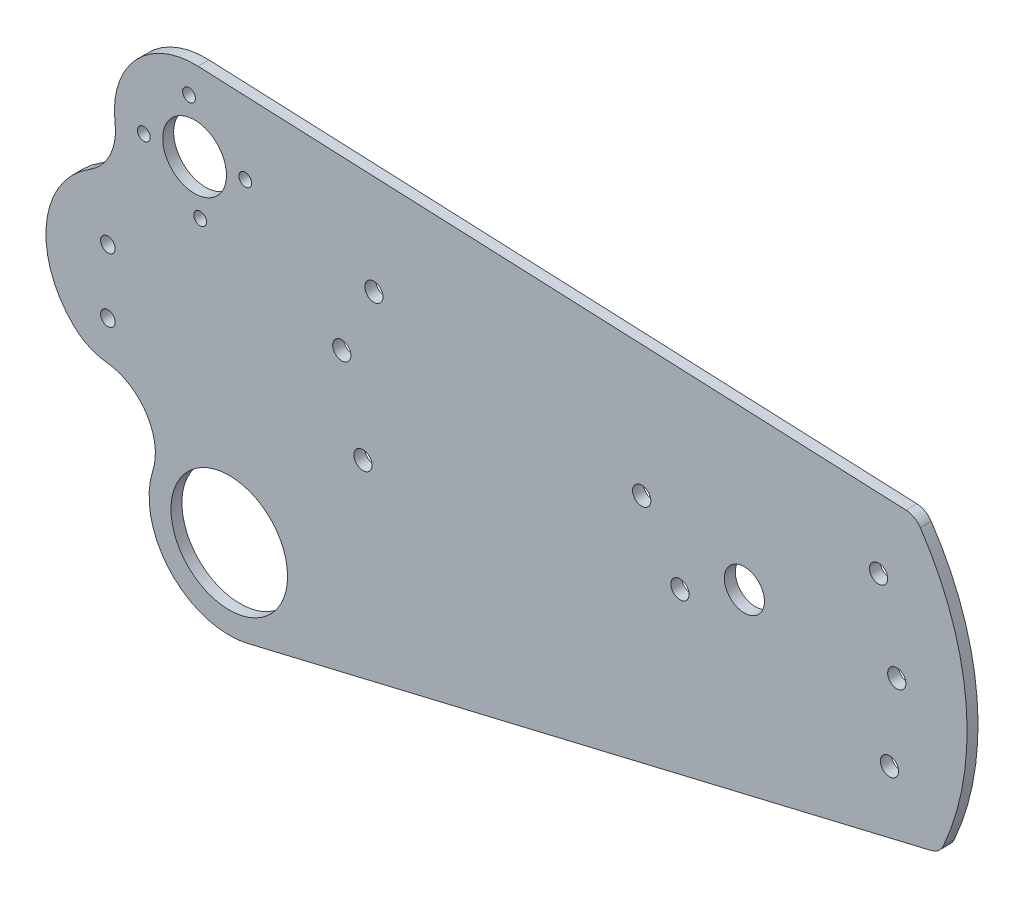
ISO-10303-21;
HEADER;
FILE_DESCRIPTION(('STEP AP214'),'2;1');
FILE_NAME('part.step','',(''),(''),'','','');
FILE_SCHEMA(('AUTOMOTIVE_DESIGN { 1 0 10303 214 1 1 1 1 }'));
ENDSEC;
DATA;
#1=APPLICATION_CONTEXT('core data for automotive mechanical design processes');
#2=APPLICATION_PROTOCOL_DEFINITION('international standard','automotive_design',2000,#1);
#3=PRODUCT_CONTEXT('',#1,'mechanical');
#4=PRODUCT('Part','Part','',(#3));
#5=PRODUCT_RELATED_PRODUCT_CATEGORY('part','',(#4));
#6=PRODUCT_DEFINITION_FORMATION('','',#4);
#7=PRODUCT_DEFINITION_CONTEXT('part definition',#1,'design');
#8=PRODUCT_DEFINITION('design','',#6,#7);
#9=PRODUCT_DEFINITION_SHAPE('','',#8);
#10=(LENGTH_UNIT() NAMED_UNIT(*) SI_UNIT(.MILLI.,.METRE.));
#11=(NAMED_UNIT(*) PLANE_ANGLE_UNIT() SI_UNIT($,.RADIAN.));
#12=(NAMED_UNIT(*) SI_UNIT($,.STERADIAN.) SOLID_ANGLE_UNIT());
#13=UNCERTAINTY_MEASURE_WITH_UNIT(LENGTH_MEASURE(1.E-05),#10,'distance_accuracy_value','');
#14=(GEOMETRIC_REPRESENTATION_CONTEXT(3) GLOBAL_UNCERTAINTY_ASSIGNED_CONTEXT((#13)) GLOBAL_UNIT_ASSIGNED_CONTEXT((#10,
#11,#12)) REPRESENTATION_CONTEXT('',''));
#15=CARTESIAN_POINT('',(0.,0.,0.));
#16=DIRECTION('',(0.,0.,1.));
#17=DIRECTION('',(1.,0.,0.));
#18=AXIS2_PLACEMENT_3D('',#15,#16,#17);
#19=CARTESIAN_POINT('',(1.91215632842237,44.5201547339827,3.));
#20=DIRECTION('',(0.0429107910239942,0.999078907801428,0.));
#21=DIRECTION('',(-0.999078907801428,0.0429107910239942,0.));
#22=AXIS2_PLACEMENT_3D('',#19,#20,#21);
#23=PLANE('',#22);
#24=DIRECTION('',(0.999078907801428,-0.0429107910239942,0.));
#25=VECTOR('',#24,1.);
#26=CARTESIAN_POINT('',(1.91215632842237,44.5201547339827,0.));
#27=LINE('',#26,#25);
#28=CARTESIAN_POINT('',(-113.560266524185,49.4797359716314,0.));
#29=VERTEX_POINT('',#28);
#30=CARTESIAN_POINT('',(80.7215881233943,41.1352618771054,0.));
#31=VERTEX_POINT('',#30);
#32=EDGE_CURVE('E176',#29,#31,#27,.T.);
#33=ORIENTED_EDGE('',*,*,#32,.F.);
#34=DIRECTION('',(0.,0.,-1.));
#35=VECTOR('',#34,1.);
#36=CARTESIAN_POINT('',(-113.560266524185,49.4797359716314,3.));
#37=LINE('',#36,#35);
#38=CARTESIAN_POINT('',(-113.560266524185,49.4797359716314,3.));
#39=VERTEX_POINT('',#38);
#40=EDGE_CURVE('E11',#39,#29,#37,.T.);
#41=ORIENTED_EDGE('',*,*,#40,.F.);
#42=DIRECTION('',(0.999078907801428,-0.0429107910239942,0.));
#43=VECTOR('',#42,1.);
#44=CARTESIAN_POINT('',(1.91215632842237,44.5201547339827,3.));
#45=LINE('',#44,#43);
#46=CARTESIAN_POINT('',(80.7215881233943,41.1352618771054,3.));
#47=VERTEX_POINT('',#46);
#48=EDGE_CURVE('E373',#39,#47,#45,.T.);
#49=ORIENTED_EDGE('',*,*,#48,.T.);
#50=DIRECTION('',(0.,0.,-1.));
#51=VECTOR('',#50,1.);
#52=CARTESIAN_POINT('',(80.7215881233943,41.1352618771054,3.));
#53=LINE('',#52,#51);
#54=EDGE_CURVE('E95',#47,#31,#53,.T.);
#55=ORIENTED_EDGE('',*,*,#54,.T.);
#56=EDGE_LOOP('',(#33,#41,#49,#55));
#57=FACE_BOUND('',#56,.T.);
#58=ADVANCED_FACE('F35',(#57),#23,.T.);
#59=CARTESIAN_POINT('',(-114.504303926713,27.5,3.));
#60=DIRECTION('',(0.,0.,-1.));
#61=DIRECTION('',(-1.,0.,0.));
#62=AXIS2_PLACEMENT_3D('',#59,#60,#61);
#63=CYLINDRICAL_SURFACE('',#62,22.);
#64=CARTESIAN_POINT('',(-114.504303926713,27.5,0.));
#65=DIRECTION('',(0.,0.,1.));
#66=DIRECTION('',(1.,0.,0.));
#67=AXIS2_PLACEMENT_3D('',#64,#65,#66);
#68=CIRCLE('',#67,22.);
#69=CARTESIAN_POINT('',(-136.329525130672,24.732380192604,0.));
#70=VERTEX_POINT('',#69);
#71=EDGE_CURVE('E174',#29,#70,#68,.T.);
#72=ORIENTED_EDGE('',*,*,#71,.T.);
#73=DIRECTION('',(0.,0.,-1.));
#74=VECTOR('',#73,1.);
#75=CARTESIAN_POINT('',(-136.329525130672,24.732380192604,3.));
#76=LINE('',#75,#74);
#77=CARTESIAN_POINT('',(-136.329525130672,24.732380192604,3.));
#78=VERTEX_POINT('',#77);
#79=EDGE_CURVE('E44',#78,#70,#76,.T.);
#80=ORIENTED_EDGE('',*,*,#79,.F.);
#81=CARTESIAN_POINT('',(-114.504303926713,27.5,3.));
#82=DIRECTION('',(0.,0.,1.));
#83=DIRECTION('',(1.,0.,0.));
#84=AXIS2_PLACEMENT_3D('',#81,#82,#83);
#85=CIRCLE('',#84,22.);
#86=EDGE_CURVE('E375',#39,#78,#85,.T.);
#87=ORIENTED_EDGE('',*,*,#86,.F.);
#88=ORIENTED_EDGE('',*,*,#40,.T.);
#89=EDGE_LOOP('',(#72,#80,#87,#88));
#90=FACE_BOUND('',#89,.T.);
#91=ADVANCED_FACE('F175',(#90),#63,.T.);
#92=CARTESIAN_POINT('',(-151.210357769734,22.8453666875613,3.));
#93=DIRECTION('',(0.,0.,-1.));
#94=DIRECTION('',(-1.,0.,0.));
#95=AXIS2_PLACEMENT_3D('',#92,#93,#94);
#96=CYLINDRICAL_SURFACE('',#95,15.);
#97=CARTESIAN_POINT('',(-151.210357769734,22.8453666875613,0.));
#98=DIRECTION('',(0.,0.,1.));
#99=DIRECTION('',(1.,0.,0.));
#100=AXIS2_PLACEMENT_3D('',#97,#98,#99);
#101=CIRCLE('',#100,15.);
#102=CARTESIAN_POINT('',(-143.370984404331,10.0569256082972,0.));
#103=VERTEX_POINT('',#102);
#104=EDGE_CURVE('E169',#103,#70,#101,.T.);
#105=ORIENTED_EDGE('',*,*,#104,.F.);
#106=DIRECTION('',(0.,0.,-1.));
#107=VECTOR('',#106,1.);
#108=CARTESIAN_POINT('',(-143.370984404331,10.0569256082972,3.));
#109=LINE('',#108,#107);
#110=CARTESIAN_POINT('',(-143.370984404331,10.0569256082972,3.));
#111=VERTEX_POINT('',#110);
#112=EDGE_CURVE('E161',#111,#103,#109,.T.);
#113=ORIENTED_EDGE('',*,*,#112,.F.);
#114=CARTESIAN_POINT('',(-151.210357769734,22.8453666875613,3.));
#115=DIRECTION('',(0.,0.,1.));
#116=DIRECTION('',(1.,0.,0.));
#117=AXIS2_PLACEMENT_3D('',#114,#115,#116);
#118=CIRCLE('',#117,15.);
#119=EDGE_CURVE('E171',#111,#78,#118,.T.);
#120=ORIENTED_EDGE('',*,*,#119,.T.);
#121=ORIENTED_EDGE('',*,*,#79,.T.);
#122=EDGE_LOOP('',(#105,#113,#120,#121));
#123=FACE_BOUND('',#122,.T.);
#124=ADVANCED_FACE('F167',(#123),#96,.F.);
#125=CARTESIAN_POINT('',(-130.305362128659,-11.2571428571429,3.));
#126=DIRECTION('',(0.,0.,-1.));
#127=DIRECTION('',(-1.,0.,0.));
#128=AXIS2_PLACEMENT_3D('',#125,#126,#127);
#129=CYLINDRICAL_SURFACE('',#128,25.);
#130=CARTESIAN_POINT('',(-130.305362128659,-11.2571428571429,0.));
#131=DIRECTION('',(0.,0.,1.));
#132=DIRECTION('',(1.,0.,0.));
#133=AXIS2_PLACEMENT_3D('',#130,#131,#132);
#134=CIRCLE('',#133,25.);
#135=CARTESIAN_POINT('',(-147.542861296201,-29.3642857142857,0.));
#136=VERTEX_POINT('',#135);
#137=EDGE_CURVE('E182',#103,#136,#134,.T.);
#138=ORIENTED_EDGE('',*,*,#137,.T.);
#139=DIRECTION('',(0.,0.,-1.));
#140=VECTOR('',#139,1.);
#141=CARTESIAN_POINT('',(-147.542861296201,-29.3642857142857,3.));
#142=LINE('',#141,#140);
#143=CARTESIAN_POINT('',(-147.542861296201,-29.3642857142857,3.));
#144=VERTEX_POINT('',#143);
#145=EDGE_CURVE('E158',#144,#136,#142,.T.);
#146=ORIENTED_EDGE('',*,*,#145,.F.);
#147=CARTESIAN_POINT('',(-130.305362128659,-11.2571428571429,3.));
#148=DIRECTION('',(0.,0.,1.));
#149=DIRECTION('',(1.,0.,0.));
#150=AXIS2_PLACEMENT_3D('',#147,#148,#149);
#151=CIRCLE('',#150,25.);
#152=EDGE_CURVE('E380',#111,#144,#151,.T.);
#153=ORIENTED_EDGE('',*,*,#152,.F.);
#154=ORIENTED_EDGE('',*,*,#112,.T.);
#155=EDGE_LOOP('',(#138,#146,#153,#154));
#156=FACE_BOUND('',#155,.T.);
#157=ADVANCED_FACE('F272',(#156),#129,.T.);
#158=CARTESIAN_POINT('',(-137.200361795676,-18.5,3.));
#159=DIRECTION('',(0.,0.,-1.));
#160=DIRECTION('',(-1.,0.,0.));
#161=AXIS2_PLACEMENT_3D('',#158,#159,#160);
#162=CYLINDRICAL_SURFACE('',#161,15.);
#163=CARTESIAN_POINT('',(-137.200361795676,-18.5,0.));
#164=DIRECTION('',(0.,0.,1.));
#165=DIRECTION('',(1.,0.,0.));
#166=AXIS2_PLACEMENT_3D('',#163,#164,#165);
#167=CIRCLE('',#166,15.);
#168=CARTESIAN_POINT('',(-138.735140925498,-33.4212751808505,0.));
#169=VERTEX_POINT('',#168);
#170=EDGE_CURVE('E184',#136,#169,#167,.T.);
#171=ORIENTED_EDGE('',*,*,#170,.T.);
#172=DIRECTION('',(0.,0.,-1.));
#173=VECTOR('',#172,1.);
#174=CARTESIAN_POINT('',(-138.735140925498,-33.4212751808505,3.));
#175=LINE('',#174,#173);
#176=CARTESIAN_POINT('',(-138.735140925498,-33.4212751808505,3.));
#177=VERTEX_POINT('',#176);
#178=EDGE_CURVE('E156',#177,#169,#175,.T.);
#179=ORIENTED_EDGE('',*,*,#178,.F.);
#180=CARTESIAN_POINT('',(-137.200361795676,-18.5,3.));
#181=DIRECTION('',(0.,0.,1.));
#182=DIRECTION('',(1.,0.,0.));
#183=AXIS2_PLACEMENT_3D('',#180,#181,#182);
#184=CIRCLE('',#183,15.);
#185=EDGE_CURVE('E383',#144,#177,#184,.T.);
#186=ORIENTED_EDGE('',*,*,#185,.F.);
#187=ORIENTED_EDGE('',*,*,#145,.T.);
#188=EDGE_LOOP('',(#171,#179,#186,#187));
#189=FACE_BOUND('',#188,.T.);
#190=ADVANCED_FACE('F275',(#189),#162,.T.);
#191=CARTESIAN_POINT('',(-140.26992005532,-48.3425503617009,3.));
#192=DIRECTION('',(0.,0.,-1.));
#193=DIRECTION('',(-1.,0.,0.));
#194=AXIS2_PLACEMENT_3D('',#191,#192,#193);
#195=CYLINDRICAL_SURFACE('',#194,15.);
#196=CARTESIAN_POINT('',(-140.26992005532,-48.3425503617009,0.));
#197=DIRECTION('',(0.,0.,1.));
#198=DIRECTION('',(1.,0.,0.));
#199=AXIS2_PLACEMENT_3D('',#196,#197,#198);
#200=CIRCLE('',#199,15.);
#201=CARTESIAN_POINT('',(-125.965715233565,-52.8580486085475,0.));
#202=VERTEX_POINT('',#201);
#203=EDGE_CURVE('E190',#202,#169,#200,.T.);
#204=ORIENTED_EDGE('',*,*,#203,.F.);
#205=DIRECTION('',(0.,0.,-1.));
#206=VECTOR('',#205,1.);
#207=CARTESIAN_POINT('',(-125.965715233565,-52.8580486085475,3.));
#208=LINE('',#207,#206);
#209=CARTESIAN_POINT('',(-125.965715233565,-52.8580486085475,3.));
#210=VERTEX_POINT('',#209);
#211=EDGE_CURVE('E154',#210,#202,#208,.T.);
#212=ORIENTED_EDGE('',*,*,#211,.F.);
#213=CARTESIAN_POINT('',(-140.26992005532,-48.3425503617009,3.));
#214=DIRECTION('',(0.,0.,1.));
#215=DIRECTION('',(1.,0.,0.));
#216=AXIS2_PLACEMENT_3D('',#213,#214,#215);
#217=CIRCLE('',#216,15.);
#218=EDGE_CURVE('E385',#210,#177,#217,.T.);
#219=ORIENTED_EDGE('',*,*,#218,.T.);
#220=ORIENTED_EDGE('',*,*,#178,.T.);
#221=EDGE_LOOP('',(#204,#212,#219,#220));
#222=FACE_BOUND('',#221,.T.);
#223=ADVANCED_FACE('F279',(#222),#195,.F.);
#224=CARTESIAN_POINT('',(-104.986214828324,-59.4807793705892,3.));
#225=DIRECTION('',(0.,0.,-1.));
#226=DIRECTION('',(-1.,0.,0.));
#227=AXIS2_PLACEMENT_3D('',#224,#225,#226);
#228=CYLINDRICAL_SURFACE('',#227,22.);
#229=CARTESIAN_POINT('',(-104.986214828324,-59.4807793705892,0.));
#230=DIRECTION('',(0.,0.,1.));
#231=DIRECTION('',(1.,0.,0.));
#232=AXIS2_PLACEMENT_3D('',#229,#230,#231);
#233=CIRCLE('',#232,22.);
#234=CARTESIAN_POINT('',(-99.8994420943231,-80.8846281635664,0.));
#235=VERTEX_POINT('',#234);
#236=EDGE_CURVE('E193',#202,#235,#233,.T.);
#237=ORIENTED_EDGE('',*,*,#236,.T.);
#238=DIRECTION('',(0.,0.,-1.));
#239=VECTOR('',#238,1.);
#240=CARTESIAN_POINT('',(-99.8994420943231,-80.8846281635664,3.));
#241=LINE('',#240,#239);
#242=CARTESIAN_POINT('',(-99.8994420943231,-80.8846281635664,3.));
#243=VERTEX_POINT('',#242);
#244=EDGE_CURVE('E147',#243,#235,#241,.T.);
#245=ORIENTED_EDGE('',*,*,#244,.F.);
#246=CARTESIAN_POINT('',(-104.986214828324,-59.4807793705892,3.));
#247=DIRECTION('',(0.,0.,1.));
#248=DIRECTION('',(1.,0.,0.));
#249=AXIS2_PLACEMENT_3D('',#246,#247,#248);
#250=CIRCLE('',#249,22.);
#251=EDGE_CURVE('E388',#210,#243,#250,.T.);
#252=ORIENTED_EDGE('',*,*,#251,.F.);
#253=ORIENTED_EDGE('',*,*,#211,.T.);
#254=EDGE_LOOP('',(#237,#245,#252,#253));
#255=FACE_BOUND('',#254,.T.);
#256=ADVANCED_FACE('F283',(#255),#228,.T.);
#257=CARTESIAN_POINT('',(12.8543650069219,-54.0879058934321,3.));
#258=DIRECTION('',(-0.231216942454566,0.972902217862598,0.));
#259=DIRECTION('',(-0.972902217862598,-0.231216942454566,0.));
#260=AXIS2_PLACEMENT_3D('',#257,#258,#259);
#261=PLANE('',#260);
#262=DIRECTION('',(0.972902217862598,0.231216942454566,0.));
#263=VECTOR('',#262,1.);
#264=CARTESIAN_POINT('',(12.8543650069219,-54.0879058934321,0.));
#265=LINE('',#264,#263);
#266=CARTESIAN_POINT('',(87.5903381718725,-36.3263848594582,0.));
#267=VERTEX_POINT('',#266);
#268=EDGE_CURVE('E196',#235,#267,#265,.T.);
#269=ORIENTED_EDGE('',*,*,#268,.T.);
#270=DIRECTION('',(0.,0.,-1.));
#271=VECTOR('',#270,1.);
#272=CARTESIAN_POINT('',(87.5903381718725,-36.3263848594582,3.));
#273=LINE('',#272,#271);
#274=CARTESIAN_POINT('',(87.5903381718725,-36.3263848594582,3.));
#275=VERTEX_POINT('',#274);
#276=EDGE_CURVE('E145',#275,#267,#273,.T.);
#277=ORIENTED_EDGE('',*,*,#276,.F.);
#278=DIRECTION('',(0.972902217862598,0.231216942454566,0.));
#279=VECTOR('',#278,1.);
#280=CARTESIAN_POINT('',(12.8543650069219,-54.0879058934321,3.));
#281=LINE('',#280,#279);
#282=EDGE_CURVE('E138',#243,#275,#281,.T.);
#283=ORIENTED_EDGE('',*,*,#282,.F.);
#284=ORIENTED_EDGE('',*,*,#244,.T.);
#285=EDGE_LOOP('',(#269,#277,#283,#284));
#286=FACE_BOUND('',#285,.T.);
#287=ADVANCED_FACE('F287',(#286),#261,.F.);
#288=CARTESIAN_POINT('',(86.4342534595996,-31.4618737701452,3.));
#289=DIRECTION('',(0.,0.,-1.));
#290=DIRECTION('',(-1.,0.,0.));
#291=AXIS2_PLACEMENT_3D('',#288,#289,#290);
#292=CYLINDRICAL_SURFACE('',#291,5.00000000000001);
#293=CARTESIAN_POINT('',(86.4342534595996,-31.4618737701452,0.));
#294=DIRECTION('',(0.,0.,1.));
#295=DIRECTION('',(1.,0.,0.));
#296=AXIS2_PLACEMENT_3D('',#293,#294,#295);
#297=CIRCLE('',#296,5.00000000000001);
#298=CARTESIAN_POINT('',(91.,-33.5,0.));
#299=VERTEX_POINT('',#298);
#300=EDGE_CURVE('E144',#267,#299,#297,.T.);
#301=ORIENTED_EDGE('',*,*,#300,.T.);
#302=DIRECTION('',(0.,0.,-1.));
#303=VECTOR('',#302,1.);
#304=CARTESIAN_POINT('',(91.,-33.5,3.));
#305=LINE('',#304,#303);
#306=CARTESIAN_POINT('',(91.,-33.5,3.));
#307=VERTEX_POINT('',#306);
#308=EDGE_CURVE('E129',#307,#299,#305,.T.);
#309=ORIENTED_EDGE('',*,*,#308,.F.);
#310=CARTESIAN_POINT('',(86.4342534595996,-31.4618737701452,3.));
#311=DIRECTION('',(0.,0.,1.));
#312=DIRECTION('',(1.,0.,0.));
#313=AXIS2_PLACEMENT_3D('',#310,#311,#312);
#314=CIRCLE('',#313,5.00000000000001);
#315=EDGE_CURVE('E132',#275,#307,#314,.T.);
#316=ORIENTED_EDGE('',*,*,#315,.F.);
#317=ORIENTED_EDGE('',*,*,#276,.T.);
#318=EDGE_LOOP('',(#301,#309,#316,#317));
#319=FACE_BOUND('',#318,.T.);
#320=ADVANCED_FACE('F143',(#319),#292,.T.);
#321=CARTESIAN_POINT('',(22.6589151875398,-2.99288439458776,3.));
#322=DIRECTION('',(0.,0.,-1.));
#323=DIRECTION('',(-1.,0.,0.));
#324=AXIS2_PLACEMENT_3D('',#321,#322,#323);
#325=CYLINDRICAL_SURFACE('',#324,74.8410848124603);
#326=CARTESIAN_POINT('',(22.6589151875398,-2.99288439458776,0.));
#327=DIRECTION('',(0.,0.,1.));
#328=DIRECTION('',(1.,0.,0.));
#329=AXIS2_PLACEMENT_3D('',#326,#327,#328);
#330=CIRCLE('',#329,74.8410848124603);
#331=CARTESIAN_POINT('',(84.648444567044,38.9414240319674,0.));
#332=VERTEX_POINT('',#331);
#333=EDGE_CURVE('E200',#299,#332,#330,.T.);
#334=ORIENTED_EDGE('',*,*,#333,.T.);
#335=DIRECTION('',(0.,0.,-1.));
#336=VECTOR('',#335,1.);
#337=CARTESIAN_POINT('',(84.648444567044,38.9414240319674,3.));
#338=LINE('',#337,#336);
#339=CARTESIAN_POINT('',(84.648444567044,38.9414240319674,3.));
#340=VERTEX_POINT('',#339);
#341=EDGE_CURVE('E131',#340,#332,#338,.T.);
#342=ORIENTED_EDGE('',*,*,#341,.F.);
#343=CARTESIAN_POINT('',(22.6589151875398,-2.99288439458776,3.));
#344=DIRECTION('',(0.,0.,1.));
#345=DIRECTION('',(1.,0.,0.));
#346=AXIS2_PLACEMENT_3D('',#343,#344,#345);
#347=CIRCLE('',#346,74.8410848124603);
#348=EDGE_CURVE('E124',#307,#340,#347,.T.);
#349=ORIENTED_EDGE('',*,*,#348,.F.);
#350=ORIENTED_EDGE('',*,*,#308,.T.);
#351=EDGE_LOOP('',(#334,#342,#349,#350));
#352=FACE_BOUND('',#351,.T.);
#353=ADVANCED_FACE('F127',(#352),#325,.T.);
#354=CARTESIAN_POINT('',(-100.587379227419,29.0228942557423,3.));
#355=DIRECTION('',(0.,0.,-1.));
#356=DIRECTION('',(-1.,0.,0.));
#357=AXIS2_PLACEMENT_3D('',#354,#355,#356);
#358=CYLINDRICAL_SURFACE('',#357,1.74999999999997);
#359=CARTESIAN_POINT('',(-100.587379227419,29.0228942557423,3.));
#360=DIRECTION('',(0.,0.,1.));
#361=DIRECTION('',(1.,0.,0.));
#362=AXIS2_PLACEMENT_3D('',#359,#360,#361);
#363=CIRCLE('',#362,1.74999999999997);
#364=CARTESIAN_POINT('',(-98.8373792274191,29.0228942557423,3.));
#365=VERTEX_POINT('',#364);
#366=EDGE_CURVE('E253',#365,#365,#363,.T.);
#367=ORIENTED_EDGE('',*,*,#366,.T.);
#368=EDGE_LOOP('',(#367));
#369=FACE_BOUND('',#368,.T.);
#370=CARTESIAN_POINT('',(-100.587379227419,29.0228942557423,0.));
#371=DIRECTION('',(0.,0.,1.));
#372=DIRECTION('',(1.,0.,0.));
#373=AXIS2_PLACEMENT_3D('',#370,#371,#372);
#374=CIRCLE('',#373,1.74999999999997);
#375=CARTESIAN_POINT('',(-98.8373792274191,29.0228942557423,0.));
#376=VERTEX_POINT('',#375);
#377=EDGE_CURVE('E245',#376,#376,#374,.T.);
#378=ORIENTED_EDGE('',*,*,#377,.F.);
#379=EDGE_LOOP('',(#378));
#380=FACE_BOUND('',#379,.T.);
#381=ADVANCED_FACE('F296',(#369,#380),#358,.F.);
#382=CARTESIAN_POINT('',(-112.981409670971,13.5830753007057,3.));
#383=DIRECTION('',(0.,0.,-1.));
#384=DIRECTION('',(-1.,0.,0.));
#385=AXIS2_PLACEMENT_3D('',#382,#383,#384);
#386=CYLINDRICAL_SURFACE('',#385,1.74999999999997);
#387=CARTESIAN_POINT('',(-112.981409670971,13.5830753007057,3.));
#388=DIRECTION('',(0.,0.,1.));
#389=DIRECTION('',(1.,0.,0.));
#390=AXIS2_PLACEMENT_3D('',#387,#388,#389);
#391=CIRCLE('',#390,1.74999999999997);
#392=CARTESIAN_POINT('',(-111.231409670971,13.5830753007057,3.));
#393=VERTEX_POINT('',#392);
#394=EDGE_CURVE('E258',#393,#393,#391,.T.);
#395=ORIENTED_EDGE('',*,*,#394,.T.);
#396=EDGE_LOOP('',(#395));
#397=FACE_BOUND('',#396,.T.);
#398=CARTESIAN_POINT('',(-112.981409670971,13.5830753007057,0.));
#399=DIRECTION('',(0.,0.,1.));
#400=DIRECTION('',(1.,0.,0.));
#401=AXIS2_PLACEMENT_3D('',#398,#399,#400);
#402=CIRCLE('',#401,1.74999999999997);
#403=CARTESIAN_POINT('',(-111.231409670971,13.5830753007057,0.));
#404=VERTEX_POINT('',#403);
#405=EDGE_CURVE('E242',#404,#404,#402,.T.);
#406=ORIENTED_EDGE('',*,*,#405,.F.);
#407=EDGE_LOOP('',(#406));
#408=FACE_BOUND('',#407,.T.);
#409=ADVANCED_FACE('F352',(#397,#408),#386,.F.);
#410=CARTESIAN_POINT('',(-128.421228626008,25.9771057442576,3.));
#411=DIRECTION('',(0.,0.,-1.));
#412=DIRECTION('',(-1.,0.,0.));
#413=AXIS2_PLACEMENT_3D('',#410,#411,#412);
#414=CYLINDRICAL_SURFACE('',#413,1.74999999999998);
#415=CARTESIAN_POINT('',(-128.421228626008,25.9771057442576,3.));
#416=DIRECTION('',(0.,0.,1.));
#417=DIRECTION('',(1.,0.,0.));
#418=AXIS2_PLACEMENT_3D('',#415,#416,#417);
#419=CIRCLE('',#418,1.74999999999998);
#420=CARTESIAN_POINT('',(-126.671228626008,25.9771057442576,3.));
#421=VERTEX_POINT('',#420);
#422=EDGE_CURVE('E428',#421,#421,#419,.T.);
#423=ORIENTED_EDGE('',*,*,#422,.T.);
#424=EDGE_LOOP('',(#423));
#425=FACE_BOUND('',#424,.T.);
#426=CARTESIAN_POINT('',(-128.421228626008,25.9771057442576,0.));
#427=DIRECTION('',(0.,0.,1.));
#428=DIRECTION('',(1.,0.,0.));
#429=AXIS2_PLACEMENT_3D('',#426,#427,#428);
#430=CIRCLE('',#429,1.74999999999998);
#431=CARTESIAN_POINT('',(-126.671228626008,25.9771057442576,0.));
#432=VERTEX_POINT('',#431);
#433=EDGE_CURVE('E239',#432,#432,#430,.T.);
#434=ORIENTED_EDGE('',*,*,#433,.F.);
#435=EDGE_LOOP('',(#434));
#436=FACE_BOUND('',#435,.T.);
#437=ADVANCED_FACE('F348',(#425,#436),#414,.F.);
#438=CARTESIAN_POINT('',(-114.504303926713,27.5,3.));
#439=DIRECTION('',(0.,0.,-1.));
#440=DIRECTION('',(-1.,0.,0.));
#441=AXIS2_PLACEMENT_3D('',#438,#439,#440);
#442=CYLINDRICAL_SURFACE('',#441,8.75);
#443=CARTESIAN_POINT('',(-114.504303926713,27.5,3.));
#444=DIRECTION('',(0.,0.,1.));
#445=DIRECTION('',(1.,0.,0.));
#446=AXIS2_PLACEMENT_3D('',#443,#444,#445);
#447=CIRCLE('',#446,8.75);
#448=CARTESIAN_POINT('',(-105.754303926713,27.5,3.));
#449=VERTEX_POINT('',#448);
#450=EDGE_CURVE('E425',#449,#449,#447,.T.);
#451=ORIENTED_EDGE('',*,*,#450,.T.);
#452=EDGE_LOOP('',(#451));
#453=FACE_BOUND('',#452,.T.);
#454=CARTESIAN_POINT('',(-114.504303926713,27.5,0.));
#455=DIRECTION('',(0.,0.,1.));
#456=DIRECTION('',(1.,0.,0.));
#457=AXIS2_PLACEMENT_3D('',#454,#455,#456);
#458=CIRCLE('',#457,8.75);
#459=CARTESIAN_POINT('',(-105.754303926713,27.5,0.));
#460=VERTEX_POINT('',#459);
#461=EDGE_CURVE('E236',#460,#460,#458,.T.);
#462=ORIENTED_EDGE('',*,*,#461,.F.);
#463=EDGE_LOOP('',(#462));
#464=FACE_BOUND('',#463,.T.);
#465=ADVANCED_FACE('F344',(#453,#464),#442,.F.);
#466=CARTESIAN_POINT('',(-104.986214828324,-59.4807793705892,3.));
#467=DIRECTION('',(0.,0.,-1.));
#468=DIRECTION('',(-1.,0.,0.));
#469=AXIS2_PLACEMENT_3D('',#466,#467,#468);
#470=CYLINDRICAL_SURFACE('',#469,16.);
#471=CARTESIAN_POINT('',(-104.986214828324,-59.4807793705892,3.));
#472=DIRECTION('',(0.,0.,1.));
#473=DIRECTION('',(1.,0.,0.));
#474=AXIS2_PLACEMENT_3D('',#471,#472,#473);
#475=CIRCLE('',#474,16.);
#476=CARTESIAN_POINT('',(-88.9862148283235,-59.4807793705892,3.));
#477=VERTEX_POINT('',#476);
#478=EDGE_CURVE('E422',#477,#477,#475,.T.);
#479=ORIENTED_EDGE('',*,*,#478,.T.);
#480=EDGE_LOOP('',(#479));
#481=FACE_BOUND('',#480,.T.);
#482=CARTESIAN_POINT('',(-104.986214828324,-59.4807793705892,0.));
#483=DIRECTION('',(0.,0.,1.));
#484=DIRECTION('',(1.,0.,0.));
#485=AXIS2_PLACEMENT_3D('',#482,#483,#484);
#486=CIRCLE('',#485,16.);
#487=CARTESIAN_POINT('',(-88.9862148283235,-59.4807793705892,0.));
#488=VERTEX_POINT('',#487);
#489=EDGE_CURVE('E233',#488,#488,#486,.T.);
#490=ORIENTED_EDGE('',*,*,#489,.F.);
#491=EDGE_LOOP('',(#490));
#492=FACE_BOUND('',#491,.T.);
#493=ADVANCED_FACE('F340',(#481,#492),#470,.F.);
#494=CARTESIAN_POINT('',(-68.3,-21.5,3.));
#495=DIRECTION('',(0.,0.,-1.));
#496=DIRECTION('',(-1.,0.,0.));
#497=AXIS2_PLACEMENT_3D('',#494,#495,#496);
#498=CYLINDRICAL_SURFACE('',#497,2.49999999999999);
#499=CARTESIAN_POINT('',(-68.3,-21.5,3.));
#500=DIRECTION('',(0.,0.,1.));
#501=DIRECTION('',(1.,0.,0.));
#502=AXIS2_PLACEMENT_3D('',#499,#500,#501);
#503=CIRCLE('',#502,2.49999999999999);
#504=CARTESIAN_POINT('',(-65.8,-21.5,3.));
#505=VERTEX_POINT('',#504);
#506=EDGE_CURVE('E419',#505,#505,#503,.T.);
#507=ORIENTED_EDGE('',*,*,#506,.T.);
#508=EDGE_LOOP('',(#507));
#509=FACE_BOUND('',#508,.T.);
#510=CARTESIAN_POINT('',(-68.3,-21.5,0.));
#511=DIRECTION('',(0.,0.,1.));
#512=DIRECTION('',(1.,0.,0.));
#513=AXIS2_PLACEMENT_3D('',#510,#511,#512);
#514=CIRCLE('',#513,2.49999999999999);
#515=CARTESIAN_POINT('',(-65.8,-21.5,0.));
#516=VERTEX_POINT('',#515);
#517=EDGE_CURVE('E230',#516,#516,#514,.T.);
#518=ORIENTED_EDGE('',*,*,#517,.F.);
#519=EDGE_LOOP('',(#518));
#520=FACE_BOUND('',#519,.T.);
#521=ADVANCED_FACE('F336',(#509,#520),#498,.F.);
#522=CARTESIAN_POINT('',(-138.3,-5.25000000000004,3.));
#523=DIRECTION('',(0.,0.,-1.));
#524=DIRECTION('',(-1.,0.,0.));
#525=AXIS2_PLACEMENT_3D('',#522,#523,#524);
#526=CYLINDRICAL_SURFACE('',#525,2.);
#527=CARTESIAN_POINT('',(-138.3,-5.25000000000004,3.));
#528=DIRECTION('',(0.,0.,1.));
#529=DIRECTION('',(1.,0.,0.));
#530=AXIS2_PLACEMENT_3D('',#527,#528,#529);
#531=CIRCLE('',#530,2.);
#532=CARTESIAN_POINT('',(-136.3,-5.25000000000004,3.));
#533=VERTEX_POINT('',#532);
#534=EDGE_CURVE('E416',#533,#533,#531,.T.);
#535=ORIENTED_EDGE('',*,*,#534,.T.);
#536=EDGE_LOOP('',(#535));
#537=FACE_BOUND('',#536,.T.);
#538=CARTESIAN_POINT('',(-138.3,-5.25000000000004,0.));
#539=DIRECTION('',(0.,0.,1.));
#540=DIRECTION('',(1.,0.,0.));
#541=AXIS2_PLACEMENT_3D('',#538,#539,#540);
#542=CIRCLE('',#541,2.);
#543=CARTESIAN_POINT('',(-136.3,-5.25000000000004,0.));
#544=VERTEX_POINT('',#543);
#545=EDGE_CURVE('E227',#544,#544,#542,.T.);
#546=ORIENTED_EDGE('',*,*,#545,.F.);
#547=EDGE_LOOP('',(#546));
#548=FACE_BOUND('',#547,.T.);
#549=ADVANCED_FACE('F332',(#537,#548),#526,.F.);
#550=CARTESIAN_POINT('',(-138.3,-22.75,3.));
#551=DIRECTION('',(0.,0.,-1.));
#552=DIRECTION('',(-1.,0.,0.));
#553=AXIS2_PLACEMENT_3D('',#550,#551,#552);
#554=CYLINDRICAL_SURFACE('',#553,2.);
#555=CARTESIAN_POINT('',(-138.3,-22.75,3.));
#556=DIRECTION('',(0.,0.,1.));
#557=DIRECTION('',(1.,0.,0.));
#558=AXIS2_PLACEMENT_3D('',#555,#556,#557);
#559=CIRCLE('',#558,2.);
#560=CARTESIAN_POINT('',(-136.3,-22.75,3.));
#561=VERTEX_POINT('',#560);
#562=EDGE_CURVE('E413',#561,#561,#559,.T.);
#563=ORIENTED_EDGE('',*,*,#562,.T.);
#564=EDGE_LOOP('',(#563));
#565=FACE_BOUND('',#564,.T.);
#566=CARTESIAN_POINT('',(-138.3,-22.75,0.));
#567=DIRECTION('',(0.,0.,1.));
#568=DIRECTION('',(1.,0.,0.));
#569=AXIS2_PLACEMENT_3D('',#566,#567,#568);
#570=CIRCLE('',#569,2.);
#571=CARTESIAN_POINT('',(-136.3,-22.75,0.));
#572=VERTEX_POINT('',#571);
#573=EDGE_CURVE('E224',#572,#572,#570,.T.);
#574=ORIENTED_EDGE('',*,*,#573,.F.);
#575=EDGE_LOOP('',(#574));
#576=FACE_BOUND('',#575,.T.);
#577=ADVANCED_FACE('F328',(#565,#576),#554,.F.);
#578=CARTESIAN_POINT('',(-74.1,1.7,3.));
#579=DIRECTION('',(0.,0.,-1.));
#580=DIRECTION('',(-1.,0.,0.));
#581=AXIS2_PLACEMENT_3D('',#578,#579,#580);
#582=CYLINDRICAL_SURFACE('',#581,2.49999999999999);
#583=CARTESIAN_POINT('',(-74.1,1.7,3.));
#584=DIRECTION('',(0.,0.,1.));
#585=DIRECTION('',(1.,0.,0.));
#586=AXIS2_PLACEMENT_3D('',#583,#584,#585);
#587=CIRCLE('',#586,2.49999999999999);
#588=CARTESIAN_POINT('',(-71.6,1.7,3.));
#589=VERTEX_POINT('',#588);
#590=EDGE_CURVE('E410',#589,#589,#587,.T.);
#591=ORIENTED_EDGE('',*,*,#590,.T.);
#592=EDGE_LOOP('',(#591));
#593=FACE_BOUND('',#592,.T.);
#594=CARTESIAN_POINT('',(-74.1,1.7,0.));
#595=DIRECTION('',(0.,0.,1.));
#596=DIRECTION('',(1.,0.,0.));
#597=AXIS2_PLACEMENT_3D('',#594,#595,#596);
#598=CIRCLE('',#597,2.49999999999999);
#599=CARTESIAN_POINT('',(-71.6,1.7,0.));
#600=VERTEX_POINT('',#599);
#601=EDGE_CURVE('E221',#600,#600,#598,.T.);
#602=ORIENTED_EDGE('',*,*,#601,.F.);
#603=EDGE_LOOP('',(#602));
#604=FACE_BOUND('',#603,.T.);
#605=ADVANCED_FACE('F324',(#593,#604),#582,.F.);
#606=CARTESIAN_POINT('',(-65.3,20.,3.));
#607=DIRECTION('',(0.,0.,-1.));
#608=DIRECTION('',(-1.,0.,0.));
#609=AXIS2_PLACEMENT_3D('',#606,#607,#608);
#610=CYLINDRICAL_SURFACE('',#609,2.50000000000001);
#611=CARTESIAN_POINT('',(-65.3,20.,3.));
#612=DIRECTION('',(0.,0.,1.));
#613=DIRECTION('',(1.,0.,0.));
#614=AXIS2_PLACEMENT_3D('',#611,#612,#613);
#615=CIRCLE('',#614,2.50000000000001);
#616=CARTESIAN_POINT('',(-62.8,20.,3.));
#617=VERTEX_POINT('',#616);
#618=EDGE_CURVE('E407',#617,#617,#615,.T.);
#619=ORIENTED_EDGE('',*,*,#618,.T.);
#620=EDGE_LOOP('',(#619));
#621=FACE_BOUND('',#620,.T.);
#622=CARTESIAN_POINT('',(-65.3,20.,0.));
#623=DIRECTION('',(0.,0.,1.));
#624=DIRECTION('',(1.,0.,0.));
#625=AXIS2_PLACEMENT_3D('',#622,#623,#624);
#626=CIRCLE('',#625,2.50000000000001);
#627=CARTESIAN_POINT('',(-62.8,20.,0.));
#628=VERTEX_POINT('',#627);
#629=EDGE_CURVE('E218',#628,#628,#626,.T.);
#630=ORIENTED_EDGE('',*,*,#629,.F.);
#631=EDGE_LOOP('',(#630));
#632=FACE_BOUND('',#631,.T.);
#633=ADVANCED_FACE('F320',(#621,#632),#610,.F.);
#634=CARTESIAN_POINT('',(78.2,-0.100000000000003,3.));
#635=DIRECTION('',(0.,0.,-1.));
#636=DIRECTION('',(-1.,0.,0.));
#637=AXIS2_PLACEMENT_3D('',#634,#635,#636);
#638=CYLINDRICAL_SURFACE('',#637,2.5);
#639=CARTESIAN_POINT('',(78.2,-0.100000000000003,3.));
#640=DIRECTION('',(0.,0.,1.));
#641=DIRECTION('',(1.,0.,0.));
#642=AXIS2_PLACEMENT_3D('',#639,#640,#641);
#643=CIRCLE('',#642,2.5);
#644=CARTESIAN_POINT('',(80.7,-0.100000000000003,3.));
#645=VERTEX_POINT('',#644);
#646=EDGE_CURVE('E404',#645,#645,#643,.T.);
#647=ORIENTED_EDGE('',*,*,#646,.T.);
#648=EDGE_LOOP('',(#647));
#649=FACE_BOUND('',#648,.T.);
#650=CARTESIAN_POINT('',(78.2,-0.100000000000003,0.));
#651=DIRECTION('',(0.,0.,1.));
#652=DIRECTION('',(1.,0.,0.));
#653=AXIS2_PLACEMENT_3D('',#650,#651,#652);
#654=CIRCLE('',#653,2.5);
#655=CARTESIAN_POINT('',(80.7,-0.100000000000003,0.));
#656=VERTEX_POINT('',#655);
#657=EDGE_CURVE('E215',#656,#656,#654,.T.);
#658=ORIENTED_EDGE('',*,*,#657,.F.);
#659=EDGE_LOOP('',(#658));
#660=FACE_BOUND('',#659,.T.);
#661=ADVANCED_FACE('F316',(#649,#660),#638,.F.);
#662=CARTESIAN_POINT('',(18.7,-8.7,3.));
#663=DIRECTION('',(0.,0.,-1.));
#664=DIRECTION('',(-1.,0.,0.));
#665=AXIS2_PLACEMENT_3D('',#662,#663,#664);
#666=CYLINDRICAL_SURFACE('',#665,2.5);
#667=CARTESIAN_POINT('',(18.7,-8.7,3.));
#668=DIRECTION('',(0.,0.,1.));
#669=DIRECTION('',(1.,0.,0.));
#670=AXIS2_PLACEMENT_3D('',#667,#668,#669);
#671=CIRCLE('',#670,2.5);
#672=CARTESIAN_POINT('',(21.2,-8.7,3.));
#673=VERTEX_POINT('',#672);
#674=EDGE_CURVE('E401',#673,#673,#671,.T.);
#675=ORIENTED_EDGE('',*,*,#674,.T.);
#676=EDGE_LOOP('',(#675));
#677=FACE_BOUND('',#676,.T.);
#678=CARTESIAN_POINT('',(18.7,-8.7,0.));
#679=DIRECTION('',(0.,0.,1.));
#680=DIRECTION('',(1.,0.,0.));
#681=AXIS2_PLACEMENT_3D('',#678,#679,#680);
#682=CIRCLE('',#681,2.5);
#683=CARTESIAN_POINT('',(21.2,-8.7,0.));
#684=VERTEX_POINT('',#683);
#685=EDGE_CURVE('E212',#684,#684,#682,.T.);
#686=ORIENTED_EDGE('',*,*,#685,.F.);
#687=EDGE_LOOP('',(#686));
#688=FACE_BOUND('',#687,.T.);
#689=ADVANCED_FACE('F312',(#677,#688),#666,.F.);
#690=CARTESIAN_POINT('',(8.20000000000003,8.3,3.));
#691=DIRECTION('',(0.,0.,-1.));
#692=DIRECTION('',(-1.,0.,0.));
#693=AXIS2_PLACEMENT_3D('',#690,#691,#692);
#694=CYLINDRICAL_SURFACE('',#693,2.5);
#695=CARTESIAN_POINT('',(8.20000000000003,8.3,3.));
#696=DIRECTION('',(0.,0.,1.));
#697=DIRECTION('',(1.,0.,0.));
#698=AXIS2_PLACEMENT_3D('',#695,#696,#697);
#699=CIRCLE('',#698,2.5);
#700=CARTESIAN_POINT('',(10.7,8.3,3.));
#701=VERTEX_POINT('',#700);
#702=EDGE_CURVE('E398',#701,#701,#699,.T.);
#703=ORIENTED_EDGE('',*,*,#702,.T.);
#704=EDGE_LOOP('',(#703));
#705=FACE_BOUND('',#704,.T.);
#706=CARTESIAN_POINT('',(8.20000000000003,8.3,0.));
#707=DIRECTION('',(0.,0.,1.));
#708=DIRECTION('',(1.,0.,0.));
#709=AXIS2_PLACEMENT_3D('',#706,#707,#708);
#710=CIRCLE('',#709,2.5);
#711=CARTESIAN_POINT('',(10.7,8.3,0.));
#712=VERTEX_POINT('',#711);
#713=EDGE_CURVE('E209',#712,#712,#710,.T.);
#714=ORIENTED_EDGE('',*,*,#713,.F.);
#715=EDGE_LOOP('',(#714));
#716=FACE_BOUND('',#715,.T.);
#717=ADVANCED_FACE('F308',(#705,#716),#694,.F.);
#718=CARTESIAN_POINT('',(36.3824499650715,0.,3.));
#719=DIRECTION('',(0.,0.,-1.));
#720=DIRECTION('',(-1.,0.,0.));
#721=AXIS2_PLACEMENT_3D('',#718,#719,#720);
#722=CYLINDRICAL_SURFACE('',#721,5.5);
#723=CARTESIAN_POINT('',(36.3824499650715,0.,3.));
#724=DIRECTION('',(0.,0.,1.));
#725=DIRECTION('',(1.,0.,0.));
#726=AXIS2_PLACEMENT_3D('',#723,#724,#725);
#727=CIRCLE('',#726,5.5);
#728=CARTESIAN_POINT('',(41.8824499650715,0.,3.));
#729=VERTEX_POINT('',#728);
#730=EDGE_CURVE('E395',#729,#729,#727,.T.);
#731=ORIENTED_EDGE('',*,*,#730,.T.);
#732=EDGE_LOOP('',(#731));
#733=FACE_BOUND('',#732,.T.);
#734=CARTESIAN_POINT('',(36.3824499650715,0.,0.));
#735=DIRECTION('',(0.,0.,1.));
#736=DIRECTION('',(1.,0.,0.));
#737=AXIS2_PLACEMENT_3D('',#734,#735,#736);
#738=CIRCLE('',#737,5.5);
#739=CARTESIAN_POINT('',(41.8824499650715,0.,0.));
#740=VERTEX_POINT('',#739);
#741=EDGE_CURVE('E206',#740,#740,#738,.T.);
#742=ORIENTED_EDGE('',*,*,#741,.F.);
#743=EDGE_LOOP('',(#742));
#744=FACE_BOUND('',#743,.T.);
#745=ADVANCED_FACE('F304',(#733,#744),#722,.F.);
#746=CARTESIAN_POINT('',(76.2,-22.,3.));
#747=DIRECTION('',(0.,0.,-1.));
#748=DIRECTION('',(-1.,0.,0.));
#749=AXIS2_PLACEMENT_3D('',#746,#747,#748);
#750=CYLINDRICAL_SURFACE('',#749,2.5);
#751=CARTESIAN_POINT('',(76.2,-22.,3.));
#752=DIRECTION('',(0.,0.,1.));
#753=DIRECTION('',(1.,0.,0.));
#754=AXIS2_PLACEMENT_3D('',#751,#752,#753);
#755=CIRCLE('',#754,2.5);
#756=CARTESIAN_POINT('',(78.7,-22.,3.));
#757=VERTEX_POINT('',#756);
#758=EDGE_CURVE('E392',#757,#757,#755,.T.);
#759=ORIENTED_EDGE('',*,*,#758,.T.);
#760=EDGE_LOOP('',(#759));
#761=FACE_BOUND('',#760,.T.);
#762=CARTESIAN_POINT('',(76.2,-22.,0.));
#763=DIRECTION('',(0.,0.,1.));
#764=DIRECTION('',(1.,0.,0.));
#765=AXIS2_PLACEMENT_3D('',#762,#763,#764);
#766=CIRCLE('',#765,2.5);
#767=CARTESIAN_POINT('',(78.7,-22.,0.));
#768=VERTEX_POINT('',#767);
#769=EDGE_CURVE('E203',#768,#768,#766,.T.);
#770=ORIENTED_EDGE('',*,*,#769,.F.);
#771=EDGE_LOOP('',(#770));
#772=FACE_BOUND('',#771,.T.);
#773=ADVANCED_FACE('F300',(#761,#772),#750,.F.);
#774=CARTESIAN_POINT('',(80.5070341682744,36.1398673380983,3.));
#775=DIRECTION('',(0.,0.,-1.));
#776=DIRECTION('',(-1.,0.,0.));
#777=AXIS2_PLACEMENT_3D('',#774,#775,#776);
#778=CYLINDRICAL_SURFACE('',#777,5.00000000000002);
#779=CARTESIAN_POINT('',(80.5070341682744,36.1398673380983,0.));
#780=DIRECTION('',(0.,0.,1.));
#781=DIRECTION('',(1.,0.,0.));
#782=AXIS2_PLACEMENT_3D('',#779,#780,#781);
#783=CIRCLE('',#782,5.00000000000002);
#784=EDGE_CURVE('E88',#332,#31,#783,.T.);
#785=ORIENTED_EDGE('',*,*,#784,.T.);
#786=ORIENTED_EDGE('',*,*,#54,.F.);
#787=CARTESIAN_POINT('',(80.5070341682744,36.1398673380983,3.));
#788=DIRECTION('',(0.,0.,1.));
#789=DIRECTION('',(1.,0.,0.));
#790=AXIS2_PLACEMENT_3D('',#787,#788,#789);
#791=CIRCLE('',#790,5.00000000000002);
#792=EDGE_CURVE('E52',#340,#47,#791,.T.);
#793=ORIENTED_EDGE('',*,*,#792,.F.);
#794=ORIENTED_EDGE('',*,*,#341,.T.);
#795=EDGE_LOOP('',(#785,#786,#793,#794));
#796=FACE_BOUND('',#795,.T.);
#797=ADVANCED_FACE('F297',(#796),#778,.T.);
#798=CARTESIAN_POINT('',(73.2,22.3,3.));
#799=DIRECTION('',(0.,0.,-1.));
#800=DIRECTION('',(-1.,0.,0.));
#801=AXIS2_PLACEMENT_3D('',#798,#799,#800);
#802=CYLINDRICAL_SURFACE('',#801,2.50000000000001);
#803=CARTESIAN_POINT('',(73.2,22.3,3.));
#804=DIRECTION('',(0.,0.,1.));
#805=DIRECTION('',(1.,0.,0.));
#806=AXIS2_PLACEMENT_3D('',#803,#804,#805);
#807=CIRCLE('',#806,2.50000000000001);
#808=CARTESIAN_POINT('',(75.7000000000001,22.3,3.));
#809=VERTEX_POINT('',#808);
#810=EDGE_CURVE('E250',#809,#809,#807,.T.);
#811=ORIENTED_EDGE('',*,*,#810,.T.);
#812=EDGE_LOOP('',(#811));
#813=FACE_BOUND('',#812,.T.);
#814=CARTESIAN_POINT('',(73.2,22.3,0.));
#815=DIRECTION('',(0.,0.,1.));
#816=DIRECTION('',(1.,0.,0.));
#817=AXIS2_PLACEMENT_3D('',#814,#815,#816);
#818=CIRCLE('',#817,2.50000000000001);
#819=CARTESIAN_POINT('',(75.7000000000001,22.3,0.));
#820=VERTEX_POINT('',#819);
#821=EDGE_CURVE('E262',#820,#820,#818,.T.);
#822=ORIENTED_EDGE('',*,*,#821,.F.);
#823=EDGE_LOOP('',(#822));
#824=FACE_BOUND('',#823,.T.);
#825=ADVANCED_FACE('F37',(#813,#824),#802,.F.);
#826=CARTESIAN_POINT('',(-116.027198182456,41.4169246992942,3.));
#827=DIRECTION('',(0.,0.,-1.));
#828=DIRECTION('',(-1.,0.,0.));
#829=AXIS2_PLACEMENT_3D('',#826,#827,#828);
#830=CYLINDRICAL_SURFACE('',#829,1.75);
#831=CARTESIAN_POINT('',(-116.027198182456,41.4169246992942,3.));
#832=DIRECTION('',(0.,0.,1.));
#833=DIRECTION('',(1.,0.,0.));
#834=AXIS2_PLACEMENT_3D('',#831,#832,#833);
#835=CIRCLE('',#834,1.75);
#836=CARTESIAN_POINT('',(-114.277198182456,41.4169246992942,3.));
#837=VERTEX_POINT('',#836);
#838=EDGE_CURVE('E251',#837,#837,#835,.T.);
#839=ORIENTED_EDGE('',*,*,#838,.T.);
#840=EDGE_LOOP('',(#839));
#841=FACE_BOUND('',#840,.T.);
#842=CARTESIAN_POINT('',(-116.027198182456,41.4169246992942,0.));
#843=DIRECTION('',(0.,0.,1.));
#844=DIRECTION('',(1.,0.,0.));
#845=AXIS2_PLACEMENT_3D('',#842,#843,#844);
#846=CIRCLE('',#845,1.75);
#847=CARTESIAN_POINT('',(-114.277198182456,41.4169246992942,0.));
#848=VERTEX_POINT('',#847);
#849=EDGE_CURVE('E248',#848,#848,#846,.T.);
#850=ORIENTED_EDGE('',*,*,#849,.F.);
#851=EDGE_LOOP('',(#850));
#852=FACE_BOUND('',#851,.T.);
#853=ADVANCED_FACE('F360',(#841,#852),#830,.F.);
#854=CARTESIAN_POINT('',(0.,0.,3.));
#855=DIRECTION('',(0.,0.,1.));
#856=DIRECTION('',(1.,0.,0.));
#857=AXIS2_PLACEMENT_3D('',#854,#855,#856);
#858=PLANE('',#857);
#859=ORIENTED_EDGE('',*,*,#810,.F.);
#860=EDGE_LOOP('',(#859));
#861=FACE_BOUND('',#860,.T.);
#862=ORIENTED_EDGE('',*,*,#48,.F.);
#863=ORIENTED_EDGE('',*,*,#86,.T.);
#864=ORIENTED_EDGE('',*,*,#119,.F.);
#865=ORIENTED_EDGE('',*,*,#152,.T.);
#866=ORIENTED_EDGE('',*,*,#185,.T.);
#867=ORIENTED_EDGE('',*,*,#218,.F.);
#868=ORIENTED_EDGE('',*,*,#251,.T.);
#869=ORIENTED_EDGE('',*,*,#282,.T.);
#870=ORIENTED_EDGE('',*,*,#315,.T.);
#871=ORIENTED_EDGE('',*,*,#348,.T.);
#872=ORIENTED_EDGE('',*,*,#792,.T.);
#873=EDGE_LOOP('',(#862,#863,#864,#865,#866,#867,#868,#869,#870,#871,#872));
#874=FACE_BOUND('',#873,.T.);
#875=ORIENTED_EDGE('',*,*,#758,.F.);
#876=EDGE_LOOP('',(#875));
#877=FACE_BOUND('',#876,.T.);
#878=ORIENTED_EDGE('',*,*,#730,.F.);
#879=EDGE_LOOP('',(#878));
#880=FACE_BOUND('',#879,.T.);
#881=ORIENTED_EDGE('',*,*,#702,.F.);
#882=EDGE_LOOP('',(#881));
#883=FACE_BOUND('',#882,.T.);
#884=ORIENTED_EDGE('',*,*,#674,.F.);
#885=EDGE_LOOP('',(#884));
#886=FACE_BOUND('',#885,.T.);
#887=ORIENTED_EDGE('',*,*,#646,.F.);
#888=EDGE_LOOP('',(#887));
#889=FACE_BOUND('',#888,.T.);
#890=ORIENTED_EDGE('',*,*,#618,.F.);
#891=EDGE_LOOP('',(#890));
#892=FACE_BOUND('',#891,.T.);
#893=ORIENTED_EDGE('',*,*,#590,.F.);
#894=EDGE_LOOP('',(#893));
#895=FACE_BOUND('',#894,.T.);
#896=ORIENTED_EDGE('',*,*,#562,.F.);
#897=EDGE_LOOP('',(#896));
#898=FACE_BOUND('',#897,.T.);
#899=ORIENTED_EDGE('',*,*,#534,.F.);
#900=EDGE_LOOP('',(#899));
#901=FACE_BOUND('',#900,.T.);
#902=ORIENTED_EDGE('',*,*,#506,.F.);
#903=EDGE_LOOP('',(#902));
#904=FACE_BOUND('',#903,.T.);
#905=ORIENTED_EDGE('',*,*,#478,.F.);
#906=EDGE_LOOP('',(#905));
#907=FACE_BOUND('',#906,.T.);
#908=ORIENTED_EDGE('',*,*,#450,.F.);
#909=EDGE_LOOP('',(#908));
#910=FACE_BOUND('',#909,.T.);
#911=ORIENTED_EDGE('',*,*,#422,.F.);
#912=EDGE_LOOP('',(#911));
#913=FACE_BOUND('',#912,.T.);
#914=ORIENTED_EDGE('',*,*,#394,.F.);
#915=EDGE_LOOP('',(#914));
#916=FACE_BOUND('',#915,.T.);
#917=ORIENTED_EDGE('',*,*,#366,.F.);
#918=EDGE_LOOP('',(#917));
#919=FACE_BOUND('',#918,.T.);
#920=ORIENTED_EDGE('',*,*,#838,.F.);
#921=EDGE_LOOP('',(#920));
#922=FACE_BOUND('',#921,.T.);
#923=ADVANCED_FACE('F135',(#861,#874,#877,#880,#883,#886,#889,#892,#895,#898,#901,#904,#907,
#910,#913,#916,#919,#922),#858,.T.);
#924=CARTESIAN_POINT('',(0.,0.,0.));
#925=DIRECTION('',(0.,0.,1.));
#926=DIRECTION('',(1.,0.,0.));
#927=AXIS2_PLACEMENT_3D('',#924,#925,#926);
#928=PLANE('',#927);
#929=ORIENTED_EDGE('',*,*,#821,.T.);
#930=EDGE_LOOP('',(#929));
#931=FACE_BOUND('',#930,.T.);
#932=ORIENTED_EDGE('',*,*,#32,.T.);
#933=ORIENTED_EDGE('',*,*,#784,.F.);
#934=ORIENTED_EDGE('',*,*,#333,.F.);
#935=ORIENTED_EDGE('',*,*,#300,.F.);
#936=ORIENTED_EDGE('',*,*,#268,.F.);
#937=ORIENTED_EDGE('',*,*,#236,.F.);
#938=ORIENTED_EDGE('',*,*,#203,.T.);
#939=ORIENTED_EDGE('',*,*,#170,.F.);
#940=ORIENTED_EDGE('',*,*,#137,.F.);
#941=ORIENTED_EDGE('',*,*,#104,.T.);
#942=ORIENTED_EDGE('',*,*,#71,.F.);
#943=EDGE_LOOP('',(#932,#933,#934,#935,#936,#937,#938,#939,#940,#941,#942));
#944=FACE_BOUND('',#943,.T.);
#945=ORIENTED_EDGE('',*,*,#769,.T.);
#946=EDGE_LOOP('',(#945));
#947=FACE_BOUND('',#946,.T.);
#948=ORIENTED_EDGE('',*,*,#741,.T.);
#949=EDGE_LOOP('',(#948));
#950=FACE_BOUND('',#949,.T.);
#951=ORIENTED_EDGE('',*,*,#713,.T.);
#952=EDGE_LOOP('',(#951));
#953=FACE_BOUND('',#952,.T.);
#954=ORIENTED_EDGE('',*,*,#685,.T.);
#955=EDGE_LOOP('',(#954));
#956=FACE_BOUND('',#955,.T.);
#957=ORIENTED_EDGE('',*,*,#657,.T.);
#958=EDGE_LOOP('',(#957));
#959=FACE_BOUND('',#958,.T.);
#960=ORIENTED_EDGE('',*,*,#629,.T.);
#961=EDGE_LOOP('',(#960));
#962=FACE_BOUND('',#961,.T.);
#963=ORIENTED_EDGE('',*,*,#601,.T.);
#964=EDGE_LOOP('',(#963));
#965=FACE_BOUND('',#964,.T.);
#966=ORIENTED_EDGE('',*,*,#573,.T.);
#967=EDGE_LOOP('',(#966));
#968=FACE_BOUND('',#967,.T.);
#969=ORIENTED_EDGE('',*,*,#545,.T.);
#970=EDGE_LOOP('',(#969));
#971=FACE_BOUND('',#970,.T.);
#972=ORIENTED_EDGE('',*,*,#517,.T.);
#973=EDGE_LOOP('',(#972));
#974=FACE_BOUND('',#973,.T.);
#975=ORIENTED_EDGE('',*,*,#489,.T.);
#976=EDGE_LOOP('',(#975));
#977=FACE_BOUND('',#976,.T.);
#978=ORIENTED_EDGE('',*,*,#461,.T.);
#979=EDGE_LOOP('',(#978));
#980=FACE_BOUND('',#979,.T.);
#981=ORIENTED_EDGE('',*,*,#433,.T.);
#982=EDGE_LOOP('',(#981));
#983=FACE_BOUND('',#982,.T.);
#984=ORIENTED_EDGE('',*,*,#405,.T.);
#985=EDGE_LOOP('',(#984));
#986=FACE_BOUND('',#985,.T.);
#987=ORIENTED_EDGE('',*,*,#377,.T.);
#988=EDGE_LOOP('',(#987));
#989=FACE_BOUND('',#988,.T.);
#990=ORIENTED_EDGE('',*,*,#849,.T.);
#991=EDGE_LOOP('',(#990));
#992=FACE_BOUND('',#991,.T.);
#993=ADVANCED_FACE('F179',(#931,#944,#947,#950,#953,#956,#959,#962,#965,#968,#971,#974,#977,
#980,#983,#986,#989,#992),#928,.F.);
#994=CLOSED_SHELL('',(#58,#91,#124,#157,#190,#223,#256,#287,#320,#353,#381,#409,#437,#465,#493,
#521,#549,#577,#605,#633,#661,#689,#717,#745,#773,#797,#825,#853,#923,#993));
#995=MANIFOLD_SOLID_BREP('B2',#994);
#996=ADVANCED_BREP_SHAPE_REPRESENTATION('',(#18,#995),#14);
#997=SHAPE_DEFINITION_REPRESENTATION(#9,#996);
ENDSEC;
END-ISO-10303-21;
